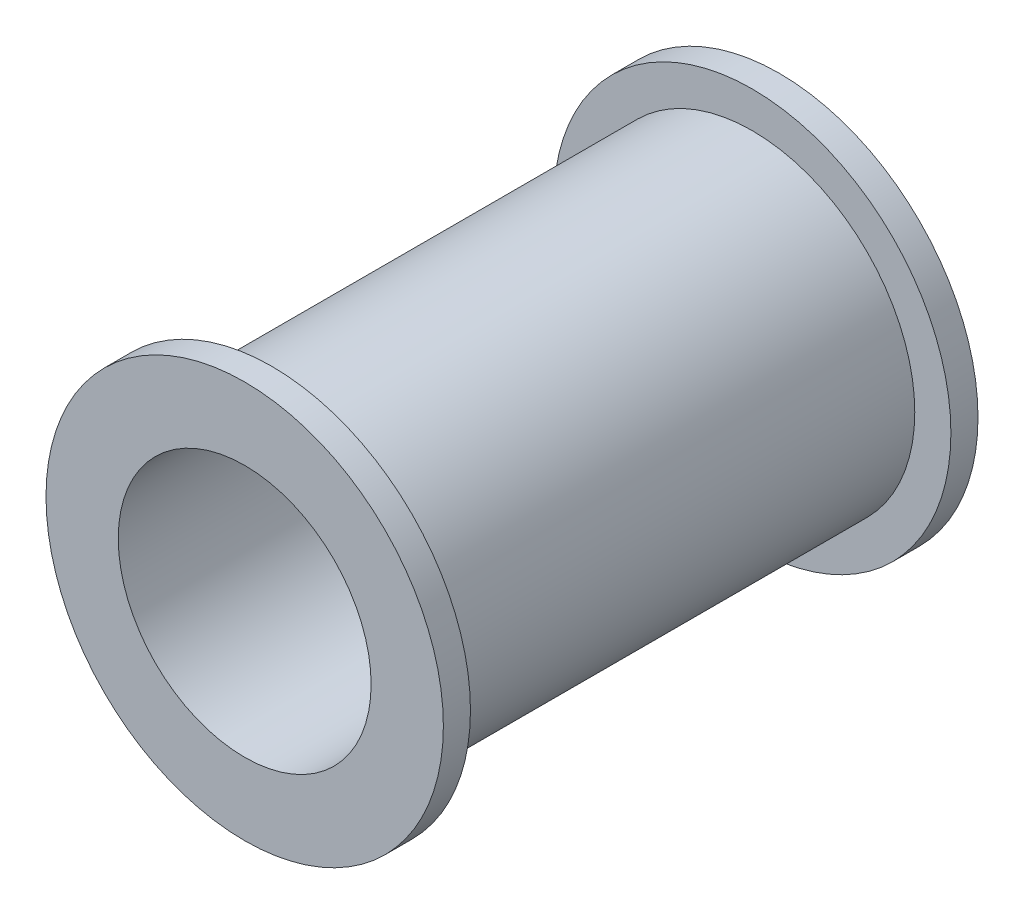
ISO-10303-21;
HEADER;
FILE_DESCRIPTION(('STEP AP214'),'2;1');
FILE_NAME('part.step','',(''),(''),'','','');
FILE_SCHEMA(('AUTOMOTIVE_DESIGN { 1 0 10303 214 1 1 1 1 }'));
ENDSEC;
DATA;
#1=APPLICATION_CONTEXT('core data for automotive mechanical design processes');
#2=APPLICATION_PROTOCOL_DEFINITION('international standard','automotive_design',2000,#1);
#3=PRODUCT_CONTEXT('',#1,'mechanical');
#4=PRODUCT('Part','Part','',(#3));
#5=PRODUCT_RELATED_PRODUCT_CATEGORY('part','',(#4));
#6=PRODUCT_DEFINITION_FORMATION('','',#4);
#7=PRODUCT_DEFINITION_CONTEXT('part definition',#1,'design');
#8=PRODUCT_DEFINITION('design','',#6,#7);
#9=PRODUCT_DEFINITION_SHAPE('','',#8);
#10=(LENGTH_UNIT() NAMED_UNIT(*) SI_UNIT(.MILLI.,.METRE.));
#11=(NAMED_UNIT(*) PLANE_ANGLE_UNIT() SI_UNIT($,.RADIAN.));
#12=(NAMED_UNIT(*) SI_UNIT($,.STERADIAN.) SOLID_ANGLE_UNIT());
#13=UNCERTAINTY_MEASURE_WITH_UNIT(LENGTH_MEASURE(1.E-05),#10,'distance_accuracy_value','');
#14=(GEOMETRIC_REPRESENTATION_CONTEXT(3) GLOBAL_UNCERTAINTY_ASSIGNED_CONTEXT((#13)) GLOBAL_UNIT_ASSIGNED_CONTEXT((#10,
#11,#12)) REPRESENTATION_CONTEXT('',''));
#15=CARTESIAN_POINT('',(0.,0.,0.));
#16=DIRECTION('',(0.,0.,1.));
#17=DIRECTION('',(1.,0.,0.));
#18=AXIS2_PLACEMENT_3D('',#15,#16,#17);
#19=CARTESIAN_POINT('',(-4.97633536173072,-25.8000000000002,-8.9));
#20=DIRECTION('',(0.,0.,1.));
#21=DIRECTION('',(1.,0.,0.));
#22=AXIS2_PLACEMENT_3D('',#19,#20,#21);
#23=CYLINDRICAL_SURFACE('',#22,9.);
#24=CARTESIAN_POINT('',(-4.97633536173072,-25.8000000000002,19.2));
#25=DIRECTION('',(0.,0.,1.));
#26=DIRECTION('',(1.,0.,0.));
#27=AXIS2_PLACEMENT_3D('',#24,#25,#26);
#28=CIRCLE('',#27,9.);
#29=CARTESIAN_POINT('',(4.02366463826928,-25.8000000000002,19.2));
#30=VERTEX_POINT('',#29);
#31=EDGE_CURVE('E181',#30,#30,#28,.F.);
#32=ORIENTED_EDGE('',*,*,#31,.T.);
#33=EDGE_LOOP('',(#32));
#34=FACE_BOUND('',#33,.T.);
#35=CARTESIAN_POINT('',(-4.97633536173072,-34.8000000000003,-4.15));
#36=CARTESIAN_POINT('',(-4.88584665332466,-34.7999983855406,-4.15000352025594));
#37=CARTESIAN_POINT('',(-4.79531142971951,-34.79862116508,-4.15758388378687));
#38=CARTESIAN_POINT('',(-4.61678806690869,-34.7932598589693,-4.18768792679663));
#39=CARTESIAN_POINT('',(-4.52880221359329,-34.7892735050399,-4.2102246089551));
#40=CARTESIAN_POINT('',(-4.35798560788171,-34.7791402713722,-4.26953213541076));
#41=CARTESIAN_POINT('',(-4.27515042386352,-34.7729952800637,-4.30629054103006));
#42=CARTESIAN_POINT('',(-4.1168318071127,-34.7592173951202,-4.39296369179096));
#43=CARTESIAN_POINT('',(-4.04134769586047,-34.7515846390047,-4.44287722110752));
#44=CARTESIAN_POINT('',(-3.89902421014775,-34.7355798688107,-4.55503456175407));
#45=CARTESIAN_POINT('',(-3.83227860907916,-34.7272012382808,-4.61739643630988));
#46=CARTESIAN_POINT('',(-3.71013762867485,-34.7106986751282,-4.75242620525674));
#47=CARTESIAN_POINT('',(-3.65474302921111,-34.7025747600381,-4.82509480719277));
#48=CARTESIAN_POINT('',(-3.55649134781209,-34.6874372416783,-4.97933159592427));
#49=CARTESIAN_POINT('',(-3.51372874322107,-34.6804321767453,-5.06096087805342));
#50=CARTESIAN_POINT('',(-3.44255950462219,-34.6684182668957,-5.23039220557705));
#51=CARTESIAN_POINT('',(-3.41415172636827,-34.6634092628766,-5.31819375833428));
#52=CARTESIAN_POINT('',(-3.37279760906753,-34.6560209776315,-5.4964770130551));
#53=CARTESIAN_POINT('',(-3.35968828403519,-34.6536139958228,-5.58691973888689));
#54=CARTESIAN_POINT('',(-3.34879749056408,-34.651618678238,-5.76875059842365));
#55=CARTESIAN_POINT('',(-3.35101474846932,-34.6520301082486,-5.86013865294055));
#56=CARTESIAN_POINT('',(-3.37058181506661,-34.6555998823986,-6.04009122558569));
#57=CARTESIAN_POINT('',(-3.38774707172925,-34.6587247246751,-6.12867657315263));
#58=CARTESIAN_POINT('',(-3.43643258718104,-34.6673166741492,-6.30168906628584));
#59=CARTESIAN_POINT('',(-3.46795341557268,-34.6727838742867,-6.3861160467085));
#60=CARTESIAN_POINT('',(-3.54463807764174,-34.6854799507667,-6.54895953916801));
#61=CARTESIAN_POINT('',(-3.58987716026735,-34.692718500139,-6.62733983045493));
#62=CARTESIAN_POINT('',(-3.69266087100678,-34.7081351706672,-6.77546652921036));
#63=CARTESIAN_POINT('',(-3.75020665993284,-34.7163133804215,-6.84521212124287));
#64=CARTESIAN_POINT('',(-3.87696893197162,-34.7328343015979,-6.97515659215863));
#65=CARTESIAN_POINT('',(-3.94634344116815,-34.7411776722168,-7.03520133751632));
#66=CARTESIAN_POINT('',(-4.09426313012115,-34.7569789557869,-7.14282276396759));
#67=CARTESIAN_POINT('',(-4.17280838958455,-34.7644368610408,-7.19039933668327));
#68=CARTESIAN_POINT('',(-4.3369952547349,-34.7776403481838,-7.27175357818327));
#69=CARTESIAN_POINT('',(-4.42264455037432,-34.7833840427335,-7.30551605275215));
#70=CARTESIAN_POINT('',(-4.59852532064223,-34.792497191988,-7.35813231568553));
#71=CARTESIAN_POINT('',(-4.68875634349205,-34.7958668802949,-7.37698757094183));
#72=CARTESIAN_POINT('',(-4.8699123445829,-34.7998204913444,-7.39904156266496));
#73=CARTESIAN_POINT('',(-4.96081080279752,-34.8004420123921,-7.40245162421245));
#74=CARTESIAN_POINT('',(-5.14187940929249,-34.7989328143375,-7.39408409145299));
#75=CARTESIAN_POINT('',(-5.23204959046723,-34.7968022202486,-7.38230718700606));
#76=CARTESIAN_POINT('',(-5.40843781445886,-34.7900515494576,-7.34407575869371));
#77=CARTESIAN_POINT('',(-5.49467961040424,-34.7854494810456,-7.31772736846594));
#78=CARTESIAN_POINT('',(-5.66152175034874,-34.7742697263205,-7.25121516250051));
#79=CARTESIAN_POINT('',(-5.74212173304927,-34.7676919136243,-7.21105046294643));
#80=CARTESIAN_POINT('',(-5.89629976476233,-34.753196599453,-7.11757242791286));
#81=CARTESIAN_POINT('',(-5.96979767227779,-34.7452660991294,-7.06412896710803));
#82=CARTESIAN_POINT('',(-6.10685768046882,-34.7289804388061,-6.945787554807));
#83=CARTESIAN_POINT('',(-6.17041892438138,-34.7206252422703,-6.88088861661803));
#84=CARTESIAN_POINT('',(-6.28659757731648,-34.7043082204746,-6.74052477219966));
#85=CARTESIAN_POINT('',(-6.33907125153468,-34.6963524742577,-6.66494007507826));
#86=CARTESIAN_POINT('',(-6.43057699820841,-34.6818543426252,-6.50590464805129));
#87=CARTESIAN_POINT('',(-6.46960954676181,-34.6753119071516,-6.42245419689184));
#88=CARTESIAN_POINT('',(-6.53291736526234,-34.664428146888,-6.25043378464311));
#89=CARTESIAN_POINT('',(-6.55726046846069,-34.6600767200873,-6.16188945657406));
#90=CARTESIAN_POINT('',(-6.59070916666756,-34.6540437742377,-5.9818822718672));
#91=CARTESIAN_POINT('',(-6.59981634235214,-34.6523619782245,-5.89041971898882));
#92=CARTESIAN_POINT('',(-6.60248479372522,-34.651872041289,-5.70861049994636));
#93=CARTESIAN_POINT('',(-6.59627261493762,-34.6530220231332,-5.61826719323372));
#94=CARTESIAN_POINT('',(-6.568972566939,-34.6579735831941,-5.43993472915372));
#95=CARTESIAN_POINT('',(-6.5478847716751,-34.6617751482296,-5.35194556008613));
#96=CARTESIAN_POINT('',(-6.49152469566725,-34.6715844869634,-5.18092910637698));
#97=CARTESIAN_POINT('',(-6.45627521681327,-34.6775887127883,-5.09789409065798));
#98=CARTESIAN_POINT('',(-6.3726165878241,-34.6911296512765,-4.93888011905617));
#99=CARTESIAN_POINT('',(-6.32420660227061,-34.6986664612192,-4.8629016115257));
#100=CARTESIAN_POINT('',(-6.21480626576097,-34.7145543216032,-4.71901915584497));
#101=CARTESIAN_POINT('',(-6.15365040149784,-34.7229152337746,-4.65124212344339));
#102=CARTESIAN_POINT('',(-6.02084095909659,-34.739433801339,-4.52683606996458));
#103=CARTESIAN_POINT('',(-5.94918497047423,-34.7475914095556,-4.47020961570942));
#104=CARTESIAN_POINT('',(-5.79670193270419,-34.7628629687955,-4.36927819555154));
#105=CARTESIAN_POINT('',(-5.71580402913366,-34.7699677440558,-4.3250788526615));
#106=CARTESIAN_POINT('',(-5.54763106020981,-34.7822437306858,-4.25096808763615));
#107=CARTESIAN_POINT('',(-5.46036220385946,-34.7874167953653,-4.22104296293202));
#108=CARTESIAN_POINT('',(-5.30672845486284,-34.7941659615846,-4.18255229042261));
#109=CARTESIAN_POINT('',(-5.2412731370433,-34.7963416021294,-4.17036558257516));
#110=CARTESIAN_POINT('',(-5.10933202798928,-34.7992591986319,-4.15408823418358));
#111=CARTESIAN_POINT('',(-5.04284625983805,-34.8000011866584,-4.14999741254585));
#112=CARTESIAN_POINT('',(-4.97633536173072,-34.8000000000003,-4.15));
#113=B_SPLINE_CURVE_WITH_KNOTS('',3,(#35,#36,#37,#38,#39,#40,#41,#42,#43,#44,#45,#46,#47,#48,
#49,#50,#51,#52,#53,#54,#55,#56,#57,#58,#59,#60,#61,#62,#63,#64,#65,#66,#67,#68,#69,#70,#71,#72,
#73,#74,#75,#76,#77,#78,#79,#80,#81,#82,#83,#84,#85,#86,#87,#88,#89,#90,#91,#92,#93,#94,#95,#96,
#97,#98,#99,#100,#101,#102,#103,#104,#105,#106,#107,#108,#109,#110,#111,#112),.UNSPECIFIED.,.T.,
.F.,(4,2,2,2,2,2,2,2,2,2,2,2,2,2,2,2,2,2,2,2,2,2,2,2,2,2,2,2,2,2,2,2,2,2,2,2,2,2,4),(0.,
0.271222932248496,0.542681968914771,0.813904115440991,1.08510120381325,1.3590043227426,
1.6329262539151,1.90884784572708,2.1847474399189,2.45768002871941,2.73058993679249,
3.00017744423448,3.26977564934138,3.54088029002642,3.81201051355112,4.08709653567647,
4.36218494887067,4.63757512542276,4.91293819981203,5.18452207550944,5.45609361508533,
5.72571268819697,5.99534901179742,6.26773973702394,6.54015393549526,6.81590814231549,
7.09165258064618,7.36611373672639,7.64054641662149,7.91094513795578,8.18134251513951,
8.45130625612728,8.72128713819773,8.99502074302266,9.26881728684207,9.54487506032001,
9.82066729550959,10.0200256978546,10.2193796407819),.UNSPECIFIED.);
#114=CARTESIAN_POINT('',(-4.97633536173072,-34.8000000000002,-7.4));
#115=VERTEX_POINT('',#114);
#116=EDGE_CURVE('E111',#115,#115,#113,.T.);
#117=ORIENTED_EDGE('',*,*,#116,.T.);
#118=CARTESIAN_POINT('',(-4.97633536173072,-25.8000000000002,-7.4));
#119=DIRECTION('',(0.,0.,-1.));
#120=DIRECTION('',(-1.,0.,0.));
#121=AXIS2_PLACEMENT_3D('',#118,#119,#120);
#122=CIRCLE('',#121,9.);
#123=EDGE_CURVE('E46',#115,#115,#122,.T.);
#124=ORIENTED_EDGE('',*,*,#123,.F.);
#125=EDGE_LOOP('',(#117,#124));
#126=FACE_BOUND('',#125,.T.);
#127=ADVANCED_FACE('F33',(#34,#126),#23,.T.);
#128=CARTESIAN_POINT('',(-4.97633536173072,-25.8000000000002,-8.9));
#129=DIRECTION('',(0.,0.,1.));
#130=DIRECTION('',(1.,0.,0.));
#131=AXIS2_PLACEMENT_3D('',#128,#129,#130);
#132=CYLINDRICAL_SURFACE('',#131,1.625);
#133=CARTESIAN_POINT('',(-4.97633536173072,-25.8000000000002,0.));
#134=DIRECTION('',(0.,0.,1.));
#135=DIRECTION('',(1.,0.,0.));
#136=AXIS2_PLACEMENT_3D('',#133,#134,#135);
#137=CIRCLE('',#136,1.625);
#138=CARTESIAN_POINT('',(-3.35133536173072,-25.8000000000002,0.));
#139=VERTEX_POINT('',#138);
#140=EDGE_CURVE('E204',#139,#139,#137,.T.);
#141=ORIENTED_EDGE('',*,*,#140,.T.);
#142=EDGE_LOOP('',(#141));
#143=FACE_BOUND('',#142,.T.);
#144=CARTESIAN_POINT('',(-4.97633536173072,-25.8000000000002,-8.9));
#145=DIRECTION('',(0.,0.,1.));
#146=DIRECTION('',(1.,0.,0.));
#147=AXIS2_PLACEMENT_3D('',#144,#145,#146);
#148=CIRCLE('',#147,1.625);
#149=CARTESIAN_POINT('',(-3.35133536173072,-25.8000000000002,-8.9));
#150=VERTEX_POINT('',#149);
#151=EDGE_CURVE('E200',#150,#150,#148,.T.);
#152=ORIENTED_EDGE('',*,*,#151,.F.);
#153=EDGE_LOOP('',(#152));
#154=FACE_BOUND('',#153,.T.);
#155=CARTESIAN_POINT('',(-4.97633536173072,-25.8000000000003,-5.775));
#156=DIRECTION('',(0.,-0.707106781186547,0.707106781186548));
#157=DIRECTION('',(0.,0.707106781186547,0.707106781186548));
#158=AXIS2_PLACEMENT_3D('',#155,#156,#157);
#159=ELLIPSE('',#158,2.29809703885628,1.625);
#160=CARTESIAN_POINT('',(-3.35133536173072,-25.8000000000003,-5.775));
#161=VERTEX_POINT('',#160);
#162=CARTESIAN_POINT('',(-3.53476503739681,-25.0500000000004,-5.02500000000013));
#163=VERTEX_POINT('',#162);
#164=EDGE_CURVE('E99',#161,#163,#159,.T.);
#165=ORIENTED_EDGE('',*,*,#164,.F.);
#166=CARTESIAN_POINT('',(-4.97633536173072,-25.8000000000003,-5.775));
#167=DIRECTION('',(0.,0.707106781186547,0.707106781186548));
#168=DIRECTION('',(0.,-0.707106781186547,0.707106781186548));
#169=AXIS2_PLACEMENT_3D('',#166,#167,#168);
#170=ELLIPSE('',#169,2.29809703885628,1.625);
#171=CARTESIAN_POINT('',(-6.60133536173072,-25.8000000000003,-5.775));
#172=VERTEX_POINT('',#171);
#173=EDGE_CURVE('E108',#172,#161,#170,.T.);
#174=ORIENTED_EDGE('',*,*,#173,.F.);
#175=CARTESIAN_POINT('',(-6.41790568606464,-25.0500000000004,-5.02500000000013));
#176=VERTEX_POINT('',#175);
#177=EDGE_CURVE('E268',#176,#172,#159,.T.);
#178=ORIENTED_EDGE('',*,*,#177,.F.);
#179=DIRECTION('',(0.,0.,1.));
#180=VECTOR('',#179,1.);
#181=CARTESIAN_POINT('',(-6.41790568606464,-25.0500000000004,-8.9));
#182=LINE('',#181,#180);
#183=CARTESIAN_POINT('',(-6.41790568606464,-25.0500000000004,-6.52499999999987));
#184=VERTEX_POINT('',#183);
#185=EDGE_CURVE('E41',#184,#176,#182,.T.);
#186=ORIENTED_EDGE('',*,*,#185,.F.);
#187=CARTESIAN_POINT('',(-4.97633536173072,-25.8000000000003,-5.775));
#188=DIRECTION('',(0.,0.707106781186547,0.707106781186548));
#189=DIRECTION('',(0.,-0.707106781186547,0.707106781186548));
#190=AXIS2_PLACEMENT_3D('',#187,#188,#189);
#191=ELLIPSE('',#190,2.29809703885628,1.625);
#192=EDGE_CURVE('E107',#172,#184,#191,.F.);
#193=ORIENTED_EDGE('',*,*,#192,.F.);
#194=CARTESIAN_POINT('',(-4.97633536173072,-25.8000000000003,-5.775));
#195=DIRECTION('',(0.,-0.707106781186547,0.707106781186548));
#196=DIRECTION('',(0.,0.707106781186547,0.707106781186548));
#197=AXIS2_PLACEMENT_3D('',#194,#195,#196);
#198=ELLIPSE('',#197,2.29809703885628,1.625);
#199=EDGE_CURVE('E106',#161,#172,#198,.F.);
#200=ORIENTED_EDGE('',*,*,#199,.F.);
#201=CARTESIAN_POINT('',(-3.53476503739681,-25.0500000000004,-6.52499999999987));
#202=VERTEX_POINT('',#201);
#203=EDGE_CURVE('E53',#202,#161,#191,.F.);
#204=ORIENTED_EDGE('',*,*,#203,.F.);
#205=DIRECTION('',(0.,0.,1.));
#206=VECTOR('',#205,1.);
#207=CARTESIAN_POINT('',(-3.53476503739681,-25.0500000000004,-8.9));
#208=LINE('',#207,#206);
#209=EDGE_CURVE('E11',#163,#202,#208,.F.);
#210=ORIENTED_EDGE('',*,*,#209,.F.);
#211=EDGE_LOOP('',(#165,#174,#178,#186,#193,#200,#204,#210));
#212=FACE_BOUND('',#211,.T.);
#213=ADVANCED_FACE('F104',(#143,#154,#212),#132,.F.);
#214=CARTESIAN_POINT('',(-4.97633536173072,-25.8000000000002,0.));
#215=DIRECTION('',(0.,0.,1.));
#216=DIRECTION('',(1.,0.,0.));
#217=AXIS2_PLACEMENT_3D('',#214,#215,#216);
#218=PLANE('',#217);
#219=ORIENTED_EDGE('',*,*,#140,.F.);
#220=EDGE_LOOP('',(#219));
#221=FACE_BOUND('',#220,.T.);
#222=CARTESIAN_POINT('',(-4.97633536173072,-25.8000000000002,0.));
#223=DIRECTION('',(0.,0.,1.));
#224=DIRECTION('',(1.,0.,0.));
#225=AXIS2_PLACEMENT_3D('',#222,#223,#224);
#226=CIRCLE('',#225,7.);
#227=CARTESIAN_POINT('',(2.02366463826927,-25.8000000000002,0.));
#228=VERTEX_POINT('',#227);
#229=EDGE_CURVE('E194',#228,#228,#226,.F.);
#230=ORIENTED_EDGE('',*,*,#229,.F.);
#231=EDGE_LOOP('',(#230));
#232=FACE_BOUND('',#231,.T.);
#233=ADVANCED_FACE('F164',(#221,#232),#218,.T.);
#234=CARTESIAN_POINT('',(-4.97633536173072,-25.8000000000002,-8.9));
#235=DIRECTION('',(0.,0.,1.));
#236=DIRECTION('',(1.,0.,0.));
#237=AXIS2_PLACEMENT_3D('',#234,#235,#236);
#238=PLANE('',#237);
#239=DIRECTION('',(0.,-1.,0.));
#240=VECTOR('',#239,1.);
#241=CARTESIAN_POINT('',(-1.80633536173072,-32.3000000000004,-8.9));
#242=LINE('',#241,#240);
#243=CARTESIAN_POINT('',(-1.80633536173072,-29.3000000000004,-8.9));
#244=VERTEX_POINT('',#243);
#245=CARTESIAN_POINT('',(-1.80633536173072,-32.3000000000004,-8.9));
#246=VERTEX_POINT('',#245);
#247=EDGE_CURVE('E121',#244,#246,#242,.T.);
#248=ORIENTED_EDGE('',*,*,#247,.F.);
#249=DIRECTION('',(1.,0.,0.));
#250=VECTOR('',#249,1.);
#251=CARTESIAN_POINT('',(-4.97633536173072,-29.3000000000004,-8.9));
#252=LINE('',#251,#250);
#253=CARTESIAN_POINT('',(-8.14633536173072,-29.3000000000004,-8.9));
#254=VERTEX_POINT('',#253);
#255=EDGE_CURVE('E222',#254,#244,#252,.T.);
#256=ORIENTED_EDGE('',*,*,#255,.F.);
#257=DIRECTION('',(0.,1.,0.));
#258=VECTOR('',#257,1.);
#259=CARTESIAN_POINT('',(-8.14633536173072,-29.3000000000004,-8.9));
#260=LINE('',#259,#258);
#261=CARTESIAN_POINT('',(-8.14633536173072,-32.3000000000004,-8.9));
#262=VERTEX_POINT('',#261);
#263=EDGE_CURVE('E225',#262,#254,#260,.T.);
#264=ORIENTED_EDGE('',*,*,#263,.F.);
#265=DIRECTION('',(-1.,0.,0.));
#266=VECTOR('',#265,1.);
#267=CARTESIAN_POINT('',(-8.14633536173072,-32.3000000000004,-8.9));
#268=LINE('',#267,#266);
#269=EDGE_CURVE('E228',#246,#262,#268,.T.);
#270=ORIENTED_EDGE('',*,*,#269,.F.);
#271=EDGE_LOOP('',(#248,#256,#264,#270));
#272=FACE_BOUND('',#271,.T.);
#273=ORIENTED_EDGE('',*,*,#151,.T.);
#274=EDGE_LOOP('',(#273));
#275=FACE_BOUND('',#274,.T.);
#276=CARTESIAN_POINT('',(-4.97633536173072,-25.8000000000002,-8.9));
#277=DIRECTION('',(0.,0.,-1.));
#278=DIRECTION('',(-1.,0.,0.));
#279=AXIS2_PLACEMENT_3D('',#276,#277,#278);
#280=CIRCLE('',#279,11.);
#281=CARTESIAN_POINT('',(-15.9763353617307,-25.8000000000002,-8.9));
#282=VERTEX_POINT('',#281);
#283=EDGE_CURVE('E253',#282,#282,#280,.T.);
#284=ORIENTED_EDGE('',*,*,#283,.T.);
#285=EDGE_LOOP('',(#284));
#286=FACE_BOUND('',#285,.T.);
#287=ADVANCED_FACE('F160',(#272,#275,#286),#238,.F.);
#288=CARTESIAN_POINT('',(-4.97633536173072,-25.8000000000002,20.7));
#289=DIRECTION('',(0.,0.,1.));
#290=DIRECTION('',(1.,0.,0.));
#291=AXIS2_PLACEMENT_3D('',#288,#289,#290);
#292=PLANE('',#291);
#293=CARTESIAN_POINT('',(-4.97633536173072,-25.8000000000002,20.7));
#294=DIRECTION('',(0.,0.,1.));
#295=DIRECTION('',(1.,0.,0.));
#296=AXIS2_PLACEMENT_3D('',#293,#294,#295);
#297=CIRCLE('',#296,7.);
#298=CARTESIAN_POINT('',(2.02366463826927,-25.8000000000002,20.7));
#299=VERTEX_POINT('',#298);
#300=EDGE_CURVE('E209',#299,#299,#297,.T.);
#301=ORIENTED_EDGE('',*,*,#300,.F.);
#302=EDGE_LOOP('',(#301));
#303=FACE_BOUND('',#302,.T.);
#304=CARTESIAN_POINT('',(-4.97633536173072,-25.8000000000002,20.7));
#305=DIRECTION('',(0.,0.,1.));
#306=DIRECTION('',(1.,0.,0.));
#307=AXIS2_PLACEMENT_3D('',#304,#305,#306);
#308=CIRCLE('',#307,11.);
#309=CARTESIAN_POINT('',(6.02366463826928,-25.8000000000002,20.7));
#310=VERTEX_POINT('',#309);
#311=EDGE_CURVE('E258',#310,#310,#308,.T.);
#312=ORIENTED_EDGE('',*,*,#311,.T.);
#313=EDGE_LOOP('',(#312));
#314=FACE_BOUND('',#313,.T.);
#315=ADVANCED_FACE('F156',(#303,#314),#292,.T.);
#316=CARTESIAN_POINT('',(-4.97633536173072,-25.8000000000002,20.7));
#317=DIRECTION('',(0.,0.,-1.));
#318=DIRECTION('',(-1.,0.,0.));
#319=AXIS2_PLACEMENT_3D('',#316,#317,#318);
#320=CYLINDRICAL_SURFACE('',#319,7.);
#321=ORIENTED_EDGE('',*,*,#300,.T.);
#322=EDGE_LOOP('',(#321));
#323=FACE_BOUND('',#322,.T.);
#324=ORIENTED_EDGE('',*,*,#229,.T.);
#325=EDGE_LOOP('',(#324));
#326=FACE_BOUND('',#325,.T.);
#327=ADVANCED_FACE('F142',(#323,#326),#320,.F.);
#328=CARTESIAN_POINT('',(-4.97633536173072,-29.3000000000004,-2.65));
#329=DIRECTION('',(0.,1.,0.));
#330=DIRECTION('',(0.,0.,1.));
#331=AXIS2_PLACEMENT_3D('',#328,#329,#330);
#332=PLANE('',#331);
#333=CARTESIAN_POINT('',(-4.97633536173072,-29.3000000000004,-5.775));
#334=DIRECTION('',(0.,1.,0.));
#335=DIRECTION('',(0.,0.,1.));
#336=AXIS2_PLACEMENT_3D('',#333,#334,#335);
#337=CIRCLE('',#336,1.625);
#338=CARTESIAN_POINT('',(-4.97633536173072,-29.3000000000004,-4.15));
#339=VERTEX_POINT('',#338);
#340=EDGE_CURVE('E189',#339,#339,#337,.F.);
#341=ORIENTED_EDGE('',*,*,#340,.F.);
#342=EDGE_LOOP('',(#341));
#343=FACE_BOUND('',#342,.T.);
#344=ORIENTED_EDGE('',*,*,#255,.T.);
#345=DIRECTION('',(0.,0.,-1.));
#346=VECTOR('',#345,1.);
#347=CARTESIAN_POINT('',(-1.80633536173072,-29.3000000000004,-2.65));
#348=LINE('',#347,#346);
#349=CARTESIAN_POINT('',(-1.80633536173072,-29.3000000000004,-2.65));
#350=VERTEX_POINT('',#349);
#351=EDGE_CURVE('E214',#350,#244,#348,.T.);
#352=ORIENTED_EDGE('',*,*,#351,.F.);
#353=DIRECTION('',(1.,0.,0.));
#354=VECTOR('',#353,1.);
#355=CARTESIAN_POINT('',(-4.97633536173072,-29.3000000000004,-2.65));
#356=LINE('',#355,#354);
#357=CARTESIAN_POINT('',(-8.14633536173072,-29.3000000000004,-2.65));
#358=VERTEX_POINT('',#357);
#359=EDGE_CURVE('E122',#358,#350,#356,.T.);
#360=ORIENTED_EDGE('',*,*,#359,.F.);
#361=DIRECTION('',(0.,0.,-1.));
#362=VECTOR('',#361,1.);
#363=CARTESIAN_POINT('',(-8.14633536173072,-29.3000000000004,-2.65));
#364=LINE('',#363,#362);
#365=EDGE_CURVE('E213',#358,#254,#364,.T.);
#366=ORIENTED_EDGE('',*,*,#365,.T.);
#367=EDGE_LOOP('',(#344,#352,#360,#366));
#368=FACE_BOUND('',#367,.T.);
#369=ADVANCED_FACE('F138',(#343,#368),#332,.F.);
#370=CARTESIAN_POINT('',(-8.14633536173072,-29.3000000000004,-2.65));
#371=DIRECTION('',(-1.,0.,0.));
#372=DIRECTION('',(0.,0.,1.));
#373=AXIS2_PLACEMENT_3D('',#370,#371,#372);
#374=PLANE('',#373);
#375=ORIENTED_EDGE('',*,*,#263,.T.);
#376=ORIENTED_EDGE('',*,*,#365,.F.);
#377=DIRECTION('',(0.,1.,0.));
#378=VECTOR('',#377,1.);
#379=CARTESIAN_POINT('',(-8.14633536173072,-29.3000000000004,-2.65));
#380=LINE('',#379,#378);
#381=CARTESIAN_POINT('',(-8.14633536173072,-32.3000000000004,-2.65));
#382=VERTEX_POINT('',#381);
#383=EDGE_CURVE('E217',#382,#358,#380,.T.);
#384=ORIENTED_EDGE('',*,*,#383,.F.);
#385=DIRECTION('',(0.,0.,-1.));
#386=VECTOR('',#385,1.);
#387=CARTESIAN_POINT('',(-8.14633536173072,-32.3000000000004,-2.65));
#388=LINE('',#387,#386);
#389=EDGE_CURVE('E219',#382,#262,#388,.T.);
#390=ORIENTED_EDGE('',*,*,#389,.T.);
#391=EDGE_LOOP('',(#375,#376,#384,#390));
#392=FACE_BOUND('',#391,.T.);
#393=ADVANCED_FACE('F141',(#392),#374,.F.);
#394=CARTESIAN_POINT('',(-8.14633536173072,-32.3000000000004,-2.65));
#395=DIRECTION('',(0.,-1.,0.));
#396=DIRECTION('',(0.,0.,-1.));
#397=AXIS2_PLACEMENT_3D('',#394,#395,#396);
#398=PLANE('',#397);
#399=CARTESIAN_POINT('',(-4.97633536173072,-32.3000000000004,-5.775));
#400=DIRECTION('',(0.,-1.,0.));
#401=DIRECTION('',(0.,0.,-1.));
#402=AXIS2_PLACEMENT_3D('',#399,#400,#401);
#403=CIRCLE('',#402,1.625);
#404=CARTESIAN_POINT('',(-4.97633536173072,-32.3000000000004,-7.4));
#405=VERTEX_POINT('',#404);
#406=EDGE_CURVE('E100',#405,#405,#403,.F.);
#407=ORIENTED_EDGE('',*,*,#406,.F.);
#408=EDGE_LOOP('',(#407));
#409=FACE_BOUND('',#408,.T.);
#410=ORIENTED_EDGE('',*,*,#269,.T.);
#411=ORIENTED_EDGE('',*,*,#389,.F.);
#412=DIRECTION('',(-1.,0.,0.));
#413=VECTOR('',#412,1.);
#414=CARTESIAN_POINT('',(-8.14633536173072,-32.3000000000004,-2.65));
#415=LINE('',#414,#413);
#416=CARTESIAN_POINT('',(-1.80633536173072,-32.3000000000004,-2.65));
#417=VERTEX_POINT('',#416);
#418=EDGE_CURVE('E235',#417,#382,#415,.T.);
#419=ORIENTED_EDGE('',*,*,#418,.F.);
#420=DIRECTION('',(0.,0.,-1.));
#421=VECTOR('',#420,1.);
#422=CARTESIAN_POINT('',(-1.80633536173072,-32.3000000000004,-2.65));
#423=LINE('',#422,#421);
#424=EDGE_CURVE('E216',#417,#246,#423,.T.);
#425=ORIENTED_EDGE('',*,*,#424,.T.);
#426=EDGE_LOOP('',(#410,#411,#419,#425));
#427=FACE_BOUND('',#426,.T.);
#428=ADVANCED_FACE('F146',(#409,#427),#398,.F.);
#429=CARTESIAN_POINT('',(-1.80633536173072,-32.3000000000004,-2.65));
#430=DIRECTION('',(1.,0.,0.));
#431=DIRECTION('',(0.,0.,-1.));
#432=AXIS2_PLACEMENT_3D('',#429,#430,#431);
#433=PLANE('',#432);
#434=ORIENTED_EDGE('',*,*,#247,.T.);
#435=ORIENTED_EDGE('',*,*,#424,.F.);
#436=DIRECTION('',(0.,-1.,0.));
#437=VECTOR('',#436,1.);
#438=CARTESIAN_POINT('',(-1.80633536173072,-32.3000000000004,-2.65));
#439=LINE('',#438,#437);
#440=EDGE_CURVE('E237',#350,#417,#439,.T.);
#441=ORIENTED_EDGE('',*,*,#440,.F.);
#442=ORIENTED_EDGE('',*,*,#351,.T.);
#443=EDGE_LOOP('',(#434,#435,#441,#442));
#444=FACE_BOUND('',#443,.T.);
#445=ADVANCED_FACE('F136',(#444),#433,.F.);
#446=CARTESIAN_POINT('',(0.,0.,-2.65));
#447=DIRECTION('',(0.,0.,1.));
#448=DIRECTION('',(1.,0.,0.));
#449=AXIS2_PLACEMENT_3D('',#446,#447,#448);
#450=PLANE('',#449);
#451=ORIENTED_EDGE('',*,*,#359,.T.);
#452=ORIENTED_EDGE('',*,*,#440,.T.);
#453=ORIENTED_EDGE('',*,*,#418,.T.);
#454=ORIENTED_EDGE('',*,*,#383,.T.);
#455=EDGE_LOOP('',(#451,#452,#453,#454));
#456=FACE_BOUND('',#455,.T.);
#457=ADVANCED_FACE('F133',(#456),#450,.F.);
#458=CARTESIAN_POINT('',(-4.97633536173072,-36.5500000000004,-5.775));
#459=DIRECTION('',(0.,1.,0.));
#460=DIRECTION('',(0.,0.,1.));
#461=AXIS2_PLACEMENT_3D('',#458,#459,#460);
#462=CYLINDRICAL_SURFACE('',#461,1.625);
#463=ORIENTED_EDGE('',*,*,#116,.F.);
#464=EDGE_LOOP('',(#463));
#465=FACE_BOUND('',#464,.T.);
#466=ORIENTED_EDGE('',*,*,#406,.T.);
#467=EDGE_LOOP('',(#466));
#468=FACE_BOUND('',#467,.T.);
#469=ADVANCED_FACE('F131',(#465,#468),#462,.F.);
#470=ORIENTED_EDGE('',*,*,#340,.T.);
#471=EDGE_LOOP('',(#470));
#472=FACE_BOUND('',#471,.T.);
#473=ORIENTED_EDGE('',*,*,#173,.T.);
#474=ORIENTED_EDGE('',*,*,#199,.T.);
#475=EDGE_LOOP('',(#473,#474));
#476=FACE_BOUND('',#475,.T.);
#477=ADVANCED_FACE('F186',(#472,#476),#462,.F.);
#478=CARTESIAN_POINT('',(-4.97633536173072,-25.0500000000004,-5.775));
#479=DIRECTION('',(0.,-1.,0.));
#480=DIRECTION('',(0.,0.,-1.));
#481=AXIS2_PLACEMENT_3D('',#478,#479,#480);
#482=PLANE('',#481);
#483=ORIENTED_EDGE('',*,*,#185,.T.);
#484=CARTESIAN_POINT('',(-4.97633536173072,-25.0500000000004,-5.775));
#485=DIRECTION('',(0.,-1.,0.));
#486=DIRECTION('',(0.,0.,-1.));
#487=AXIS2_PLACEMENT_3D('',#484,#485,#486);
#488=CIRCLE('',#487,1.625);
#489=EDGE_CURVE('E101',#176,#184,#488,.T.);
#490=ORIENTED_EDGE('',*,*,#489,.T.);
#491=EDGE_LOOP('',(#483,#490));
#492=FACE_BOUND('',#491,.T.);
#493=ADVANCED_FACE('F129',(#492),#482,.T.);
#494=ORIENTED_EDGE('',*,*,#192,.T.);
#495=ORIENTED_EDGE('',*,*,#489,.F.);
#496=ORIENTED_EDGE('',*,*,#177,.T.);
#497=EDGE_LOOP('',(#494,#495,#496));
#498=FACE_BOUND('',#497,.T.);
#499=ADVANCED_FACE('F124',(#498),#462,.F.);
#500=ORIENTED_EDGE('',*,*,#209,.T.);
#501=EDGE_CURVE('E95',#202,#163,#488,.T.);
#502=ORIENTED_EDGE('',*,*,#501,.T.);
#503=EDGE_LOOP('',(#500,#502));
#504=FACE_BOUND('',#503,.T.);
#505=ADVANCED_FACE('F94',(#504),#482,.T.);
#506=ORIENTED_EDGE('',*,*,#203,.T.);
#507=ORIENTED_EDGE('',*,*,#164,.T.);
#508=ORIENTED_EDGE('',*,*,#501,.F.);
#509=EDGE_LOOP('',(#506,#507,#508));
#510=FACE_BOUND('',#509,.T.);
#511=ADVANCED_FACE('F98',(#510),#462,.F.);
#512=CARTESIAN_POINT('',(-4.97633536173072,-25.8000000000002,19.2));
#513=DIRECTION('',(0.,0.,1.));
#514=DIRECTION('',(1.,0.,0.));
#515=AXIS2_PLACEMENT_3D('',#512,#513,#514);
#516=CYLINDRICAL_SURFACE('',#515,11.);
#517=CARTESIAN_POINT('',(-4.97633536173072,-25.8000000000002,19.2));
#518=DIRECTION('',(0.,0.,1.));
#519=DIRECTION('',(1.,0.,0.));
#520=AXIS2_PLACEMENT_3D('',#517,#518,#519);
#521=CIRCLE('',#520,11.);
#522=CARTESIAN_POINT('',(6.02366463826928,-25.8000000000002,19.2));
#523=VERTEX_POINT('',#522);
#524=EDGE_CURVE('E262',#523,#523,#521,.T.);
#525=ORIENTED_EDGE('',*,*,#524,.T.);
#526=EDGE_LOOP('',(#525));
#527=FACE_BOUND('',#526,.T.);
#528=ORIENTED_EDGE('',*,*,#311,.F.);
#529=EDGE_LOOP('',(#528));
#530=FACE_BOUND('',#529,.T.);
#531=ADVANCED_FACE('F279',(#527,#530),#516,.T.);
#532=CARTESIAN_POINT('',(-4.97633536173072,-25.8000000000002,19.2));
#533=DIRECTION('',(0.,0.,1.));
#534=DIRECTION('',(1.,0.,0.));
#535=AXIS2_PLACEMENT_3D('',#532,#533,#534);
#536=PLANE('',#535);
#537=ORIENTED_EDGE('',*,*,#31,.F.);
#538=EDGE_LOOP('',(#537));
#539=FACE_BOUND('',#538,.T.);
#540=ORIENTED_EDGE('',*,*,#524,.F.);
#541=EDGE_LOOP('',(#540));
#542=FACE_BOUND('',#541,.T.);
#543=ADVANCED_FACE('F284',(#539,#542),#536,.F.);
#544=CARTESIAN_POINT('',(-4.97633536173072,-25.8000000000002,-7.4));
#545=DIRECTION('',(0.,0.,-1.));
#546=DIRECTION('',(-1.,0.,0.));
#547=AXIS2_PLACEMENT_3D('',#544,#545,#546);
#548=CYLINDRICAL_SURFACE('',#547,11.);
#549=CARTESIAN_POINT('',(-4.97633536173072,-25.8000000000002,-7.4));
#550=DIRECTION('',(0.,0.,-1.));
#551=DIRECTION('',(-1.,0.,0.));
#552=AXIS2_PLACEMENT_3D('',#549,#550,#551);
#553=CIRCLE('',#552,11.);
#554=CARTESIAN_POINT('',(-15.9763353617307,-25.8000000000002,-7.4));
#555=VERTEX_POINT('',#554);
#556=EDGE_CURVE('E255',#555,#555,#553,.T.);
#557=ORIENTED_EDGE('',*,*,#556,.T.);
#558=EDGE_LOOP('',(#557));
#559=FACE_BOUND('',#558,.T.);
#560=ORIENTED_EDGE('',*,*,#283,.F.);
#561=EDGE_LOOP('',(#560));
#562=FACE_BOUND('',#561,.T.);
#563=ADVANCED_FACE('F377',(#559,#562),#548,.T.);
#564=CARTESIAN_POINT('',(-4.97633536173072,-25.8000000000002,-7.4));
#565=DIRECTION('',(0.,0.,-1.));
#566=DIRECTION('',(-1.,0.,0.));
#567=AXIS2_PLACEMENT_3D('',#564,#565,#566);
#568=PLANE('',#567);
#569=ORIENTED_EDGE('',*,*,#123,.T.);
#570=EDGE_LOOP('',(#569));
#571=FACE_BOUND('',#570,.T.);
#572=ORIENTED_EDGE('',*,*,#556,.F.);
#573=EDGE_LOOP('',(#572));
#574=FACE_BOUND('',#573,.T.);
#575=ADVANCED_FACE('F403',(#571,#574),#568,.F.);
#576=CLOSED_SHELL('',(#127,#213,#233,#287,#315,#327,#369,#393,#428,#445,#457,#469,#477,#493,
#499,#505,#511,#531,#543,#563,#575));
#577=MANIFOLD_SOLID_BREP('B2',#576);
#578=ADVANCED_BREP_SHAPE_REPRESENTATION('',(#18,#577),#14);
#579=SHAPE_DEFINITION_REPRESENTATION(#9,#578);
ENDSEC;
END-ISO-10303-21;
